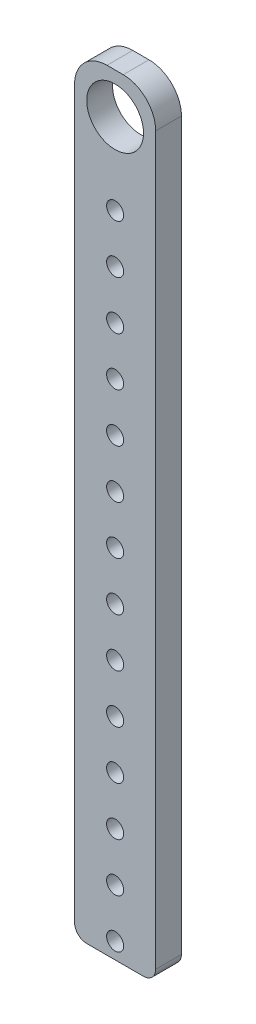
ISO-10303-21;
HEADER;
FILE_DESCRIPTION(('STEP AP214'),'2;1');
FILE_NAME('part.step','',(''),(''),'','','');
FILE_SCHEMA(('AUTOMOTIVE_DESIGN { 1 0 10303 214 1 1 1 1 }'));
ENDSEC;
DATA;
#1=APPLICATION_CONTEXT('core data for automotive mechanical design processes');
#2=APPLICATION_PROTOCOL_DEFINITION('international standard','automotive_design',2000,#1);
#3=PRODUCT_CONTEXT('',#1,'mechanical');
#4=PRODUCT('Part','Part','',(#3));
#5=PRODUCT_RELATED_PRODUCT_CATEGORY('part','',(#4));
#6=PRODUCT_DEFINITION_FORMATION('','',#4);
#7=PRODUCT_DEFINITION_CONTEXT('part definition',#1,'design');
#8=PRODUCT_DEFINITION('design','',#6,#7);
#9=PRODUCT_DEFINITION_SHAPE('','',#8);
#10=(LENGTH_UNIT() NAMED_UNIT(*) SI_UNIT(.MILLI.,.METRE.));
#11=(NAMED_UNIT(*) PLANE_ANGLE_UNIT() SI_UNIT($,.RADIAN.));
#12=(NAMED_UNIT(*) SI_UNIT($,.STERADIAN.) SOLID_ANGLE_UNIT());
#13=UNCERTAINTY_MEASURE_WITH_UNIT(LENGTH_MEASURE(1.E-05),#10,'distance_accuracy_value','');
#14=(GEOMETRIC_REPRESENTATION_CONTEXT(3) GLOBAL_UNCERTAINTY_ASSIGNED_CONTEXT((#13)) GLOBAL_UNIT_ASSIGNED_CONTEXT((#10,
#11,#12)) REPRESENTATION_CONTEXT('',''));
#15=CARTESIAN_POINT('',(0.,0.,0.));
#16=DIRECTION('',(0.,0.,1.));
#17=DIRECTION('',(1.,0.,0.));
#18=AXIS2_PLACEMENT_3D('',#15,#16,#17);
#19=CARTESIAN_POINT('',(0.,0.,6.35));
#20=DIRECTION('',(0.,0.,-1.));
#21=DIRECTION('',(-1.,0.,0.));
#22=AXIS2_PLACEMENT_3D('',#19,#20,#21);
#23=PLANE('',#22);
#24=DIRECTION('',(0.,1.,0.));
#25=VECTOR('',#24,1.);
#26=CARTESIAN_POINT('',(9.99999999999996,-95.0000000000001,6.35));
#27=LINE('',#26,#25);
#28=CARTESIAN_POINT('',(9.99999999999996,-92.0000000000001,6.35));
#29=VERTEX_POINT('',#28);
#30=CARTESIAN_POINT('',(10.,86.9999999999999,6.35));
#31=VERTEX_POINT('',#30);
#32=EDGE_CURVE('E130',#29,#31,#27,.T.);
#33=ORIENTED_EDGE('',*,*,#32,.T.);
#34=CARTESIAN_POINT('',(2.00000000000002,86.9999999999999,6.35));
#35=DIRECTION('',(0.,0.,-1.));
#36=DIRECTION('',(-1.,0.,0.));
#37=AXIS2_PLACEMENT_3D('',#34,#35,#36);
#38=CIRCLE('',#37,8.);
#39=CARTESIAN_POINT('',(2.00000000000001,94.9999999999999,6.35));
#40=VERTEX_POINT('',#39);
#41=EDGE_CURVE('E54',#31,#40,#38,.F.);
#42=ORIENTED_EDGE('',*,*,#41,.T.);
#43=DIRECTION('',(-1.,0.,0.));
#44=VECTOR('',#43,1.);
#45=CARTESIAN_POINT('',(-10.,94.9999999999999,6.35));
#46=LINE('',#45,#44);
#47=CARTESIAN_POINT('',(-2.00000000000002,94.9999999999999,6.35));
#48=VERTEX_POINT('',#47);
#49=EDGE_CURVE('E195',#40,#48,#46,.T.);
#50=ORIENTED_EDGE('',*,*,#49,.T.);
#51=CARTESIAN_POINT('',(-2.00000000000002,86.9999999999999,6.35));
#52=DIRECTION('',(0.,0.,-1.));
#53=DIRECTION('',(-1.,0.,0.));
#54=AXIS2_PLACEMENT_3D('',#51,#52,#53);
#55=CIRCLE('',#54,8.);
#56=CARTESIAN_POINT('',(-10.,86.9999999999999,6.35));
#57=VERTEX_POINT('',#56);
#58=EDGE_CURVE('E61',#48,#57,#55,.F.);
#59=ORIENTED_EDGE('',*,*,#58,.T.);
#60=DIRECTION('',(0.,-1.,0.));
#61=VECTOR('',#60,1.);
#62=CARTESIAN_POINT('',(-10.,-95.0000000000001,6.35));
#63=LINE('',#62,#61);
#64=CARTESIAN_POINT('',(-10.,-92.0000000000001,6.35));
#65=VERTEX_POINT('',#64);
#66=EDGE_CURVE('E202',#57,#65,#63,.T.);
#67=ORIENTED_EDGE('',*,*,#66,.T.);
#68=CARTESIAN_POINT('',(-7.00000000000004,-92.0000000000001,6.35));
#69=DIRECTION('',(0.,0.,-1.));
#70=DIRECTION('',(-1.,0.,0.));
#71=AXIS2_PLACEMENT_3D('',#68,#69,#70);
#72=CIRCLE('',#71,3.);
#73=CARTESIAN_POINT('',(-7.00000000000004,-95.0000000000001,6.35));
#74=VERTEX_POINT('',#73);
#75=EDGE_CURVE('E166',#65,#74,#72,.F.);
#76=ORIENTED_EDGE('',*,*,#75,.T.);
#77=DIRECTION('',(1.,0.,0.));
#78=VECTOR('',#77,1.);
#79=CARTESIAN_POINT('',(-10.,-95.0000000000001,6.35));
#80=LINE('',#79,#78);
#81=CARTESIAN_POINT('',(6.99999999999996,-95.0000000000001,6.35));
#82=VERTEX_POINT('',#81);
#83=EDGE_CURVE('E132',#74,#82,#80,.T.);
#84=ORIENTED_EDGE('',*,*,#83,.T.);
#85=CARTESIAN_POINT('',(6.99999999999996,-92.0000000000001,6.35));
#86=DIRECTION('',(0.,0.,-1.));
#87=DIRECTION('',(-1.,0.,0.));
#88=AXIS2_PLACEMENT_3D('',#85,#86,#87);
#89=CIRCLE('',#88,3.);
#90=EDGE_CURVE('E169',#82,#29,#89,.F.);
#91=ORIENTED_EDGE('',*,*,#90,.T.);
#92=EDGE_LOOP('',(#33,#42,#50,#59,#67,#76,#84,#91));
#93=FACE_BOUND('',#92,.T.);
#94=CARTESIAN_POINT('',(0.,84.9999999999999,6.35));
#95=DIRECTION('',(0.,0.,1.));
#96=DIRECTION('',(1.,0.,0.));
#97=AXIS2_PLACEMENT_3D('',#94,#95,#96);
#98=CIRCLE('',#97,7.);
#99=CARTESIAN_POINT('',(7.,84.9999999999999,6.35));
#100=VERTEX_POINT('',#99);
#101=EDGE_CURVE('E140',#100,#100,#98,.T.);
#102=ORIENTED_EDGE('',*,*,#101,.F.);
#103=EDGE_LOOP('',(#102));
#104=FACE_BOUND('',#103,.T.);
#105=CARTESIAN_POINT('',(-2.65589510718706E-13,-7.0000000000001,6.35));
#106=DIRECTION('',(0.,0.,1.));
#107=DIRECTION('',(1.,0.,0.));
#108=AXIS2_PLACEMENT_3D('',#105,#106,#107);
#109=CIRCLE('',#108,2.1);
#110=CARTESIAN_POINT('',(2.09999999999973,-7.0000000000001,6.35));
#111=VERTEX_POINT('',#110);
#112=EDGE_CURVE('E306',#111,#111,#109,.T.);
#113=ORIENTED_EDGE('',*,*,#112,.F.);
#114=EDGE_LOOP('',(#113));
#115=FACE_BOUND('',#114,.T.);
#116=CARTESIAN_POINT('',(-2.24426522732077E-13,-19.0000000000001,6.35));
#117=DIRECTION('',(0.,0.,1.));
#118=DIRECTION('',(1.,0.,0.));
#119=AXIS2_PLACEMENT_3D('',#116,#117,#118);
#120=CIRCLE('',#119,2.1);
#121=CARTESIAN_POINT('',(2.09999999999978,-19.0000000000001,6.35));
#122=VERTEX_POINT('',#121);
#123=EDGE_CURVE('E312',#122,#122,#120,.T.);
#124=ORIENTED_EDGE('',*,*,#123,.F.);
#125=EDGE_LOOP('',(#124));
#126=FACE_BOUND('',#125,.T.);
#127=CARTESIAN_POINT('',(-3.06752498705335E-13,4.99999999999989,6.35));
#128=DIRECTION('',(0.,0.,1.));
#129=DIRECTION('',(1.,0.,0.));
#130=AXIS2_PLACEMENT_3D('',#127,#128,#129);
#131=CIRCLE('',#130,2.1);
#132=CARTESIAN_POINT('',(2.09999999999969,4.99999999999989,6.35));
#133=VERTEX_POINT('',#132);
#134=EDGE_CURVE('E441',#133,#133,#131,.T.);
#135=ORIENTED_EDGE('',*,*,#134,.F.);
#136=EDGE_LOOP('',(#135));
#137=FACE_BOUND('',#136,.T.);
#138=CARTESIAN_POINT('',(-3.47915486691964E-13,16.9999999999999,6.35));
#139=DIRECTION('',(0.,0.,1.));
#140=DIRECTION('',(1.,0.,0.));
#141=AXIS2_PLACEMENT_3D('',#138,#139,#140);
#142=CIRCLE('',#141,2.1);
#143=CARTESIAN_POINT('',(2.09999999999965,16.9999999999999,6.35));
#144=VERTEX_POINT('',#143);
#145=EDGE_CURVE('E434',#144,#144,#142,.T.);
#146=ORIENTED_EDGE('',*,*,#145,.F.);
#147=EDGE_LOOP('',(#146));
#148=FACE_BOUND('',#147,.T.);
#149=CARTESIAN_POINT('',(-3.89078474678593E-13,28.9999999999999,6.35));
#150=DIRECTION('',(0.,0.,1.));
#151=DIRECTION('',(1.,0.,0.));
#152=AXIS2_PLACEMENT_3D('',#149,#150,#151);
#153=CIRCLE('',#152,2.1);
#154=CARTESIAN_POINT('',(2.09999999999961,28.9999999999999,6.35));
#155=VERTEX_POINT('',#154);
#156=EDGE_CURVE('E427',#155,#155,#153,.T.);
#157=ORIENTED_EDGE('',*,*,#156,.F.);
#158=EDGE_LOOP('',(#157));
#159=FACE_BOUND('',#158,.T.);
#160=CARTESIAN_POINT('',(-4.30241462665223E-13,40.9999999999999,6.35));
#161=DIRECTION('',(0.,0.,1.));
#162=DIRECTION('',(1.,0.,0.));
#163=AXIS2_PLACEMENT_3D('',#160,#161,#162);
#164=CIRCLE('',#163,2.1);
#165=CARTESIAN_POINT('',(2.09999999999957,40.9999999999999,6.35));
#166=VERTEX_POINT('',#165);
#167=EDGE_CURVE('E420',#166,#166,#164,.T.);
#168=ORIENTED_EDGE('',*,*,#167,.F.);
#169=EDGE_LOOP('',(#168));
#170=FACE_BOUND('',#169,.T.);
#171=CARTESIAN_POINT('',(-4.71404450651852E-13,52.9999999999999,6.35));
#172=DIRECTION('',(0.,0.,1.));
#173=DIRECTION('',(1.,0.,0.));
#174=AXIS2_PLACEMENT_3D('',#171,#172,#173);
#175=CIRCLE('',#174,2.1);
#176=CARTESIAN_POINT('',(2.09999999999953,52.9999999999999,6.35));
#177=VERTEX_POINT('',#176);
#178=EDGE_CURVE('E413',#177,#177,#175,.T.);
#179=ORIENTED_EDGE('',*,*,#178,.F.);
#180=EDGE_LOOP('',(#179));
#181=FACE_BOUND('',#180,.T.);
#182=CARTESIAN_POINT('',(-5.12567438638481E-13,64.9999999999999,6.35));
#183=DIRECTION('',(0.,0.,1.));
#184=DIRECTION('',(1.,0.,0.));
#185=AXIS2_PLACEMENT_3D('',#182,#183,#184);
#186=CIRCLE('',#185,2.1);
#187=CARTESIAN_POINT('',(2.09999999999949,64.9999999999999,6.35));
#188=VERTEX_POINT('',#187);
#189=EDGE_CURVE('E406',#188,#188,#186,.T.);
#190=ORIENTED_EDGE('',*,*,#189,.F.);
#191=EDGE_LOOP('',(#190));
#192=FACE_BOUND('',#191,.T.);
#193=CARTESIAN_POINT('',(0.,-91.0000000000001,6.35));
#194=DIRECTION('',(0.,0.,1.));
#195=DIRECTION('',(1.,0.,0.));
#196=AXIS2_PLACEMENT_3D('',#193,#194,#195);
#197=CIRCLE('',#196,2.1);
#198=CARTESIAN_POINT('',(2.10000000000002,-91.0000000000001,6.35));
#199=VERTEX_POINT('',#198);
#200=EDGE_CURVE('E399',#199,#199,#197,.T.);
#201=ORIENTED_EDGE('',*,*,#200,.F.);
#202=EDGE_LOOP('',(#201));
#203=FACE_BOUND('',#202,.T.);
#204=CARTESIAN_POINT('',(0.,-79.0000000000001,6.35));
#205=DIRECTION('',(0.,0.,1.));
#206=DIRECTION('',(1.,0.,0.));
#207=AXIS2_PLACEMENT_3D('',#204,#205,#206);
#208=CIRCLE('',#207,2.1);
#209=CARTESIAN_POINT('',(2.09999999999998,-79.0000000000001,6.35));
#210=VERTEX_POINT('',#209);
#211=EDGE_CURVE('E392',#210,#210,#208,.T.);
#212=ORIENTED_EDGE('',*,*,#211,.F.);
#213=EDGE_LOOP('',(#212));
#214=FACE_BOUND('',#213,.T.);
#215=CARTESIAN_POINT('',(0.,-67.0000000000001,6.35));
#216=DIRECTION('',(0.,0.,1.));
#217=DIRECTION('',(1.,0.,0.));
#218=AXIS2_PLACEMENT_3D('',#215,#216,#217);
#219=CIRCLE('',#218,2.1);
#220=CARTESIAN_POINT('',(2.09999999999994,-67.0000000000001,6.35));
#221=VERTEX_POINT('',#220);
#222=EDGE_CURVE('E385',#221,#221,#219,.T.);
#223=ORIENTED_EDGE('',*,*,#222,.F.);
#224=EDGE_LOOP('',(#223));
#225=FACE_BOUND('',#224,.T.);
#226=CARTESIAN_POINT('',(-1.00937558772189E-13,-55.0000000000001,6.35));
#227=DIRECTION('',(0.,0.,1.));
#228=DIRECTION('',(1.,0.,0.));
#229=AXIS2_PLACEMENT_3D('',#226,#227,#228);
#230=CIRCLE('',#229,2.1);
#231=CARTESIAN_POINT('',(2.0999999999999,-55.0000000000001,6.35));
#232=VERTEX_POINT('',#231);
#233=EDGE_CURVE('E378',#232,#232,#230,.T.);
#234=ORIENTED_EDGE('',*,*,#233,.F.);
#235=EDGE_LOOP('',(#234));
#236=FACE_BOUND('',#235,.T.);
#237=CARTESIAN_POINT('',(-1.42100546758818E-13,-43.0000000000001,6.35));
#238=DIRECTION('',(0.,0.,1.));
#239=DIRECTION('',(1.,0.,0.));
#240=AXIS2_PLACEMENT_3D('',#237,#238,#239);
#241=CIRCLE('',#240,2.1);
#242=CARTESIAN_POINT('',(2.09999999999986,-43.0000000000001,6.35));
#243=VERTEX_POINT('',#242);
#244=EDGE_CURVE('E371',#243,#243,#241,.T.);
#245=ORIENTED_EDGE('',*,*,#244,.F.);
#246=EDGE_LOOP('',(#245));
#247=FACE_BOUND('',#246,.T.);
#248=CARTESIAN_POINT('',(-1.83263534745447E-13,-31.0000000000001,6.35));
#249=DIRECTION('',(0.,0.,1.));
#250=DIRECTION('',(1.,0.,0.));
#251=AXIS2_PLACEMENT_3D('',#248,#249,#250);
#252=CIRCLE('',#251,2.1);
#253=CARTESIAN_POINT('',(2.09999999999982,-31.0000000000001,6.35));
#254=VERTEX_POINT('',#253);
#255=EDGE_CURVE('E365',#254,#254,#252,.T.);
#256=ORIENTED_EDGE('',*,*,#255,.F.);
#257=EDGE_LOOP('',(#256));
#258=FACE_BOUND('',#257,.T.);
#259=ADVANCED_FACE('F45',(#93,#104,#115,#126,#137,#148,#159,#170,#181,#192,#203,#214,#225,#236,
#247,#258),#23,.F.);
#260=CARTESIAN_POINT('',(0.,0.,0.));
#261=DIRECTION('',(0.,0.,-1.));
#262=DIRECTION('',(-1.,0.,0.));
#263=AXIS2_PLACEMENT_3D('',#260,#261,#262);
#264=PLANE('',#263);
#265=CARTESIAN_POINT('',(-1.42100546758818E-13,-43.0000000000001,0.));
#266=DIRECTION('',(0.,0.,1.));
#267=DIRECTION('',(1.,0.,0.));
#268=AXIS2_PLACEMENT_3D('',#265,#266,#267);
#269=CIRCLE('',#268,2.1);
#270=CARTESIAN_POINT('',(2.09999999999986,-43.0000000000001,0.));
#271=VERTEX_POINT('',#270);
#272=EDGE_CURVE('E368',#271,#271,#269,.T.);
#273=ORIENTED_EDGE('',*,*,#272,.T.);
#274=EDGE_LOOP('',(#273));
#275=FACE_BOUND('',#274,.T.);
#276=CARTESIAN_POINT('',(0.,-67.0000000000001,0.));
#277=DIRECTION('',(0.,0.,1.));
#278=DIRECTION('',(1.,0.,0.));
#279=AXIS2_PLACEMENT_3D('',#276,#277,#278);
#280=CIRCLE('',#279,2.1);
#281=CARTESIAN_POINT('',(2.09999999999994,-67.0000000000001,0.));
#282=VERTEX_POINT('',#281);
#283=EDGE_CURVE('E382',#282,#282,#280,.T.);
#284=ORIENTED_EDGE('',*,*,#283,.T.);
#285=EDGE_LOOP('',(#284));
#286=FACE_BOUND('',#285,.T.);
#287=CARTESIAN_POINT('',(0.,-91.0000000000001,0.));
#288=DIRECTION('',(0.,0.,1.));
#289=DIRECTION('',(1.,0.,0.));
#290=AXIS2_PLACEMENT_3D('',#287,#288,#289);
#291=CIRCLE('',#290,2.1);
#292=CARTESIAN_POINT('',(2.10000000000002,-91.0000000000001,0.));
#293=VERTEX_POINT('',#292);
#294=EDGE_CURVE('E396',#293,#293,#291,.T.);
#295=ORIENTED_EDGE('',*,*,#294,.T.);
#296=EDGE_LOOP('',(#295));
#297=FACE_BOUND('',#296,.T.);
#298=CARTESIAN_POINT('',(-4.71404450651852E-13,52.9999999999999,0.));
#299=DIRECTION('',(0.,0.,1.));
#300=DIRECTION('',(1.,0.,0.));
#301=AXIS2_PLACEMENT_3D('',#298,#299,#300);
#302=CIRCLE('',#301,2.1);
#303=CARTESIAN_POINT('',(2.09999999999953,52.9999999999999,0.));
#304=VERTEX_POINT('',#303);
#305=EDGE_CURVE('E410',#304,#304,#302,.T.);
#306=ORIENTED_EDGE('',*,*,#305,.T.);
#307=EDGE_LOOP('',(#306));
#308=FACE_BOUND('',#307,.T.);
#309=CARTESIAN_POINT('',(-3.89078474678593E-13,28.9999999999999,0.));
#310=DIRECTION('',(0.,0.,1.));
#311=DIRECTION('',(1.,0.,0.));
#312=AXIS2_PLACEMENT_3D('',#309,#310,#311);
#313=CIRCLE('',#312,2.1);
#314=CARTESIAN_POINT('',(2.09999999999961,28.9999999999999,0.));
#315=VERTEX_POINT('',#314);
#316=EDGE_CURVE('E424',#315,#315,#313,.T.);
#317=ORIENTED_EDGE('',*,*,#316,.T.);
#318=EDGE_LOOP('',(#317));
#319=FACE_BOUND('',#318,.T.);
#320=CARTESIAN_POINT('',(-3.06752498705335E-13,4.99999999999989,0.));
#321=DIRECTION('',(0.,0.,1.));
#322=DIRECTION('',(1.,0.,0.));
#323=AXIS2_PLACEMENT_3D('',#320,#321,#322);
#324=CIRCLE('',#323,2.1);
#325=CARTESIAN_POINT('',(2.09999999999969,4.99999999999989,0.));
#326=VERTEX_POINT('',#325);
#327=EDGE_CURVE('E438',#326,#326,#324,.T.);
#328=ORIENTED_EDGE('',*,*,#327,.T.);
#329=EDGE_LOOP('',(#328));
#330=FACE_BOUND('',#329,.T.);
#331=CARTESIAN_POINT('',(-2.65589510718706E-13,-7.0000000000001,0.));
#332=DIRECTION('',(0.,0.,1.));
#333=DIRECTION('',(1.,0.,0.));
#334=AXIS2_PLACEMENT_3D('',#331,#332,#333);
#335=CIRCLE('',#334,2.1);
#336=CARTESIAN_POINT('',(2.09999999999973,-7.0000000000001,0.));
#337=VERTEX_POINT('',#336);
#338=EDGE_CURVE('E309',#337,#337,#335,.T.);
#339=ORIENTED_EDGE('',*,*,#338,.T.);
#340=EDGE_LOOP('',(#339));
#341=FACE_BOUND('',#340,.T.);
#342=DIRECTION('',(-1.,0.,0.));
#343=VECTOR('',#342,1.);
#344=CARTESIAN_POINT('',(-10.,94.9999999999999,0.));
#345=LINE('',#344,#343);
#346=CARTESIAN_POINT('',(2.00000000000001,94.9999999999999,0.));
#347=VERTEX_POINT('',#346);
#348=CARTESIAN_POINT('',(-2.00000000000002,94.9999999999999,0.));
#349=VERTEX_POINT('',#348);
#350=EDGE_CURVE('E139',#347,#349,#345,.T.);
#351=ORIENTED_EDGE('',*,*,#350,.F.);
#352=CARTESIAN_POINT('',(2.00000000000002,86.9999999999999,0.));
#353=DIRECTION('',(0.,0.,-1.));
#354=DIRECTION('',(-1.,0.,0.));
#355=AXIS2_PLACEMENT_3D('',#352,#353,#354);
#356=CIRCLE('',#355,8.);
#357=CARTESIAN_POINT('',(10.,86.9999999999999,0.));
#358=VERTEX_POINT('',#357);
#359=EDGE_CURVE('E137',#347,#358,#356,.T.);
#360=ORIENTED_EDGE('',*,*,#359,.T.);
#361=DIRECTION('',(0.,1.,0.));
#362=VECTOR('',#361,1.);
#363=CARTESIAN_POINT('',(9.99999999999996,-95.0000000000001,0.));
#364=LINE('',#363,#362);
#365=CARTESIAN_POINT('',(9.99999999999996,-92.0000000000001,0.));
#366=VERTEX_POINT('',#365);
#367=EDGE_CURVE('E129',#366,#358,#364,.T.);
#368=ORIENTED_EDGE('',*,*,#367,.F.);
#369=CARTESIAN_POINT('',(6.99999999999996,-92.0000000000001,0.));
#370=DIRECTION('',(0.,0.,-1.));
#371=DIRECTION('',(-1.,0.,0.));
#372=AXIS2_PLACEMENT_3D('',#369,#370,#371);
#373=CIRCLE('',#372,3.);
#374=CARTESIAN_POINT('',(6.99999999999996,-95.0000000000001,0.));
#375=VERTEX_POINT('',#374);
#376=EDGE_CURVE('E114',#366,#375,#373,.T.);
#377=ORIENTED_EDGE('',*,*,#376,.T.);
#378=DIRECTION('',(1.,0.,0.));
#379=VECTOR('',#378,1.);
#380=CARTESIAN_POINT('',(-10.,-95.0000000000001,0.));
#381=LINE('',#380,#379);
#382=CARTESIAN_POINT('',(-7.00000000000004,-95.0000000000001,0.));
#383=VERTEX_POINT('',#382);
#384=EDGE_CURVE('E155',#383,#375,#381,.T.);
#385=ORIENTED_EDGE('',*,*,#384,.F.);
#386=CARTESIAN_POINT('',(-7.00000000000004,-92.0000000000001,0.));
#387=DIRECTION('',(0.,0.,-1.));
#388=DIRECTION('',(-1.,0.,0.));
#389=AXIS2_PLACEMENT_3D('',#386,#387,#388);
#390=CIRCLE('',#389,3.);
#391=CARTESIAN_POINT('',(-10.,-92.0000000000001,0.));
#392=VERTEX_POINT('',#391);
#393=EDGE_CURVE('E126',#383,#392,#390,.T.);
#394=ORIENTED_EDGE('',*,*,#393,.T.);
#395=DIRECTION('',(0.,-1.,0.));
#396=VECTOR('',#395,1.);
#397=CARTESIAN_POINT('',(-10.,-95.0000000000001,0.));
#398=LINE('',#397,#396);
#399=CARTESIAN_POINT('',(-10.,86.9999999999999,0.));
#400=VERTEX_POINT('',#399);
#401=EDGE_CURVE('E145',#400,#392,#398,.T.);
#402=ORIENTED_EDGE('',*,*,#401,.F.);
#403=CARTESIAN_POINT('',(-2.00000000000002,86.9999999999999,0.));
#404=DIRECTION('',(0.,0.,-1.));
#405=DIRECTION('',(-1.,0.,0.));
#406=AXIS2_PLACEMENT_3D('',#403,#404,#405);
#407=CIRCLE('',#406,8.);
#408=EDGE_CURVE('E183',#400,#349,#407,.T.);
#409=ORIENTED_EDGE('',*,*,#408,.T.);
#410=EDGE_LOOP('',(#351,#360,#368,#377,#385,#394,#402,#409));
#411=FACE_BOUND('',#410,.T.);
#412=CARTESIAN_POINT('',(0.,84.9999999999999,0.));
#413=DIRECTION('',(0.,0.,1.));
#414=DIRECTION('',(1.,0.,0.));
#415=AXIS2_PLACEMENT_3D('',#412,#413,#414);
#416=CIRCLE('',#415,7.);
#417=CARTESIAN_POINT('',(7.,84.9999999999999,0.));
#418=VERTEX_POINT('',#417);
#419=EDGE_CURVE('E148',#418,#418,#416,.T.);
#420=ORIENTED_EDGE('',*,*,#419,.T.);
#421=EDGE_LOOP('',(#420));
#422=FACE_BOUND('',#421,.T.);
#423=CARTESIAN_POINT('',(-2.24426522732077E-13,-19.0000000000001,0.));
#424=DIRECTION('',(0.,0.,1.));
#425=DIRECTION('',(1.,0.,0.));
#426=AXIS2_PLACEMENT_3D('',#423,#424,#425);
#427=CIRCLE('',#426,2.1);
#428=CARTESIAN_POINT('',(2.09999999999978,-19.0000000000001,0.));
#429=VERTEX_POINT('',#428);
#430=EDGE_CURVE('E318',#429,#429,#427,.T.);
#431=ORIENTED_EDGE('',*,*,#430,.T.);
#432=EDGE_LOOP('',(#431));
#433=FACE_BOUND('',#432,.T.);
#434=CARTESIAN_POINT('',(-3.47915486691964E-13,16.9999999999999,0.));
#435=DIRECTION('',(0.,0.,1.));
#436=DIRECTION('',(1.,0.,0.));
#437=AXIS2_PLACEMENT_3D('',#434,#435,#436);
#438=CIRCLE('',#437,2.1);
#439=CARTESIAN_POINT('',(2.09999999999965,16.9999999999999,0.));
#440=VERTEX_POINT('',#439);
#441=EDGE_CURVE('E344',#440,#440,#438,.T.);
#442=ORIENTED_EDGE('',*,*,#441,.T.);
#443=EDGE_LOOP('',(#442));
#444=FACE_BOUND('',#443,.T.);
#445=CARTESIAN_POINT('',(-4.30241462665223E-13,40.9999999999999,0.));
#446=DIRECTION('',(0.,0.,1.));
#447=DIRECTION('',(1.,0.,0.));
#448=AXIS2_PLACEMENT_3D('',#445,#446,#447);
#449=CIRCLE('',#448,2.1);
#450=CARTESIAN_POINT('',(2.09999999999957,40.9999999999999,0.));
#451=VERTEX_POINT('',#450);
#452=EDGE_CURVE('E348',#451,#451,#449,.T.);
#453=ORIENTED_EDGE('',*,*,#452,.T.);
#454=EDGE_LOOP('',(#453));
#455=FACE_BOUND('',#454,.T.);
#456=CARTESIAN_POINT('',(-5.12567438638481E-13,64.9999999999999,0.));
#457=DIRECTION('',(0.,0.,1.));
#458=DIRECTION('',(1.,0.,0.));
#459=AXIS2_PLACEMENT_3D('',#456,#457,#458);
#460=CIRCLE('',#459,2.1);
#461=CARTESIAN_POINT('',(2.09999999999949,64.9999999999999,0.));
#462=VERTEX_POINT('',#461);
#463=EDGE_CURVE('E352',#462,#462,#460,.T.);
#464=ORIENTED_EDGE('',*,*,#463,.T.);
#465=EDGE_LOOP('',(#464));
#466=FACE_BOUND('',#465,.T.);
#467=CARTESIAN_POINT('',(0.,-79.0000000000001,0.));
#468=DIRECTION('',(0.,0.,1.));
#469=DIRECTION('',(1.,0.,0.));
#470=AXIS2_PLACEMENT_3D('',#467,#468,#469);
#471=CIRCLE('',#470,2.1);
#472=CARTESIAN_POINT('',(2.09999999999998,-79.0000000000001,0.));
#473=VERTEX_POINT('',#472);
#474=EDGE_CURVE('E356',#473,#473,#471,.T.);
#475=ORIENTED_EDGE('',*,*,#474,.T.);
#476=EDGE_LOOP('',(#475));
#477=FACE_BOUND('',#476,.T.);
#478=CARTESIAN_POINT('',(-1.00937558772189E-13,-55.0000000000001,0.));
#479=DIRECTION('',(0.,0.,1.));
#480=DIRECTION('',(1.,0.,0.));
#481=AXIS2_PLACEMENT_3D('',#478,#479,#480);
#482=CIRCLE('',#481,2.1);
#483=CARTESIAN_POINT('',(2.0999999999999,-55.0000000000001,0.));
#484=VERTEX_POINT('',#483);
#485=EDGE_CURVE('E360',#484,#484,#482,.T.);
#486=ORIENTED_EDGE('',*,*,#485,.T.);
#487=EDGE_LOOP('',(#486));
#488=FACE_BOUND('',#487,.T.);
#489=CARTESIAN_POINT('',(-1.83263534745447E-13,-31.0000000000001,0.));
#490=DIRECTION('',(0.,0.,1.));
#491=DIRECTION('',(1.,0.,0.));
#492=AXIS2_PLACEMENT_3D('',#489,#490,#491);
#493=CIRCLE('',#492,2.1);
#494=CARTESIAN_POINT('',(2.09999999999982,-31.0000000000001,0.));
#495=VERTEX_POINT('',#494);
#496=EDGE_CURVE('E363',#495,#495,#493,.T.);
#497=ORIENTED_EDGE('',*,*,#496,.T.);
#498=EDGE_LOOP('',(#497));
#499=FACE_BOUND('',#498,.T.);
#500=ADVANCED_FACE('F135',(#275,#286,#297,#308,#319,#330,#341,#411,#422,#433,#444,#455,#466,
#477,#488,#499),#264,.T.);
#501=CARTESIAN_POINT('',(9.99999999999996,-95.0000000000001,6.35));
#502=DIRECTION('',(-1.,0.,0.));
#503=DIRECTION('',(0.,-1.,0.));
#504=AXIS2_PLACEMENT_3D('',#501,#502,#503);
#505=PLANE('',#504);
#506=ORIENTED_EDGE('',*,*,#367,.T.);
#507=DIRECTION('',(0.,0.,-1.));
#508=VECTOR('',#507,1.);
#509=CARTESIAN_POINT('',(10.,86.9999999999999,6.35));
#510=LINE('',#509,#508);
#511=EDGE_CURVE('E69',#358,#31,#510,.F.);
#512=ORIENTED_EDGE('',*,*,#511,.T.);
#513=ORIENTED_EDGE('',*,*,#32,.F.);
#514=DIRECTION('',(0.,0.,-1.));
#515=VECTOR('',#514,1.);
#516=CARTESIAN_POINT('',(9.99999999999996,-92.0000000000001,6.35));
#517=LINE('',#516,#515);
#518=EDGE_CURVE('E118',#29,#366,#517,.T.);
#519=ORIENTED_EDGE('',*,*,#518,.T.);
#520=EDGE_LOOP('',(#506,#512,#513,#519));
#521=FACE_BOUND('',#520,.T.);
#522=ADVANCED_FACE('F128',(#521),#505,.F.);
#523=CARTESIAN_POINT('',(-10.,94.9999999999999,6.35));
#524=DIRECTION('',(0.,-1.,0.));
#525=DIRECTION('',(0.,0.,-1.));
#526=AXIS2_PLACEMENT_3D('',#523,#524,#525);
#527=PLANE('',#526);
#528=ORIENTED_EDGE('',*,*,#49,.F.);
#529=DIRECTION('',(0.,0.,-1.));
#530=VECTOR('',#529,1.);
#531=CARTESIAN_POINT('',(2.00000000000002,94.9999999999999,6.35));
#532=LINE('',#531,#530);
#533=EDGE_CURVE('E179',#40,#347,#532,.T.);
#534=ORIENTED_EDGE('',*,*,#533,.T.);
#535=ORIENTED_EDGE('',*,*,#350,.T.);
#536=DIRECTION('',(0.,0.,-1.));
#537=VECTOR('',#536,1.);
#538=CARTESIAN_POINT('',(-2.00000000000002,94.9999999999999,6.35));
#539=LINE('',#538,#537);
#540=EDGE_CURVE('E176',#349,#48,#539,.F.);
#541=ORIENTED_EDGE('',*,*,#540,.T.);
#542=EDGE_LOOP('',(#528,#534,#535,#541));
#543=FACE_BOUND('',#542,.T.);
#544=ADVANCED_FACE('F199',(#543),#527,.F.);
#545=CARTESIAN_POINT('',(-10.,-95.0000000000001,6.35));
#546=DIRECTION('',(1.,0.,0.));
#547=DIRECTION('',(0.,1.,0.));
#548=AXIS2_PLACEMENT_3D('',#545,#546,#547);
#549=PLANE('',#548);
#550=ORIENTED_EDGE('',*,*,#66,.F.);
#551=DIRECTION('',(0.,0.,-1.));
#552=VECTOR('',#551,1.);
#553=CARTESIAN_POINT('',(-10.,86.9999999999999,6.35));
#554=LINE('',#553,#552);
#555=EDGE_CURVE('E11',#57,#400,#554,.T.);
#556=ORIENTED_EDGE('',*,*,#555,.T.);
#557=ORIENTED_EDGE('',*,*,#401,.T.);
#558=DIRECTION('',(0.,0.,-1.));
#559=VECTOR('',#558,1.);
#560=CARTESIAN_POINT('',(-10.,-92.0000000000001,6.35));
#561=LINE('',#560,#559);
#562=EDGE_CURVE('E172',#392,#65,#561,.F.);
#563=ORIENTED_EDGE('',*,*,#562,.T.);
#564=EDGE_LOOP('',(#550,#556,#557,#563));
#565=FACE_BOUND('',#564,.T.);
#566=ADVANCED_FACE('F229',(#565),#549,.F.);
#567=CARTESIAN_POINT('',(-10.,-95.0000000000001,6.35));
#568=DIRECTION('',(0.,1.,0.));
#569=DIRECTION('',(0.,0.,1.));
#570=AXIS2_PLACEMENT_3D('',#567,#568,#569);
#571=PLANE('',#570);
#572=ORIENTED_EDGE('',*,*,#384,.T.);
#573=DIRECTION('',(0.,0.,-1.));
#574=VECTOR('',#573,1.);
#575=CARTESIAN_POINT('',(6.99999999999996,-95.0000000000001,6.35));
#576=LINE('',#575,#574);
#577=EDGE_CURVE('E119',#375,#82,#576,.F.);
#578=ORIENTED_EDGE('',*,*,#577,.T.);
#579=ORIENTED_EDGE('',*,*,#83,.F.);
#580=DIRECTION('',(0.,0.,-1.));
#581=VECTOR('',#580,1.);
#582=CARTESIAN_POINT('',(-7.00000000000004,-95.0000000000001,6.35));
#583=LINE('',#582,#581);
#584=EDGE_CURVE('E125',#74,#383,#583,.T.);
#585=ORIENTED_EDGE('',*,*,#584,.T.);
#586=EDGE_LOOP('',(#572,#578,#579,#585));
#587=FACE_BOUND('',#586,.T.);
#588=ADVANCED_FACE('F226',(#587),#571,.F.);
#589=CARTESIAN_POINT('',(0.,84.9999999999999,6.35));
#590=DIRECTION('',(0.,0.,-1.));
#591=DIRECTION('',(-1.,0.,0.));
#592=AXIS2_PLACEMENT_3D('',#589,#590,#591);
#593=CYLINDRICAL_SURFACE('',#592,7.);
#594=ORIENTED_EDGE('',*,*,#101,.T.);
#595=EDGE_LOOP('',(#594));
#596=FACE_BOUND('',#595,.T.);
#597=ORIENTED_EDGE('',*,*,#419,.F.);
#598=EDGE_LOOP('',(#597));
#599=FACE_BOUND('',#598,.T.);
#600=ADVANCED_FACE('F223',(#596,#599),#593,.F.);
#601=CARTESIAN_POINT('',(-2.65589510718706E-13,-7.0000000000001,6.35));
#602=DIRECTION('',(0.,0.,-1.));
#603=DIRECTION('',(-1.,0.,0.));
#604=AXIS2_PLACEMENT_3D('',#601,#602,#603);
#605=CYLINDRICAL_SURFACE('',#604,2.1);
#606=ORIENTED_EDGE('',*,*,#112,.T.);
#607=EDGE_LOOP('',(#606));
#608=FACE_BOUND('',#607,.T.);
#609=ORIENTED_EDGE('',*,*,#338,.F.);
#610=EDGE_LOOP('',(#609));
#611=FACE_BOUND('',#610,.T.);
#612=ADVANCED_FACE('F295',(#608,#611),#605,.F.);
#613=CARTESIAN_POINT('',(-2.24426522732077E-13,-19.0000000000001,6.35));
#614=DIRECTION('',(0.,0.,-1.));
#615=DIRECTION('',(-1.,0.,0.));
#616=AXIS2_PLACEMENT_3D('',#613,#614,#615);
#617=CYLINDRICAL_SURFACE('',#616,2.1);
#618=ORIENTED_EDGE('',*,*,#123,.T.);
#619=EDGE_LOOP('',(#618));
#620=FACE_BOUND('',#619,.T.);
#621=ORIENTED_EDGE('',*,*,#430,.F.);
#622=EDGE_LOOP('',(#621));
#623=FACE_BOUND('',#622,.T.);
#624=ADVANCED_FACE('F292',(#620,#623),#617,.F.);
#625=CARTESIAN_POINT('',(-3.06752498705335E-13,4.99999999999989,6.35));
#626=DIRECTION('',(0.,0.,-1.));
#627=DIRECTION('',(-1.,0.,0.));
#628=AXIS2_PLACEMENT_3D('',#625,#626,#627);
#629=CYLINDRICAL_SURFACE('',#628,2.1);
#630=ORIENTED_EDGE('',*,*,#134,.T.);
#631=EDGE_LOOP('',(#630));
#632=FACE_BOUND('',#631,.T.);
#633=ORIENTED_EDGE('',*,*,#327,.F.);
#634=EDGE_LOOP('',(#633));
#635=FACE_BOUND('',#634,.T.);
#636=ADVANCED_FACE('F288',(#632,#635),#629,.F.);
#637=CARTESIAN_POINT('',(-3.47915486691964E-13,16.9999999999999,6.35));
#638=DIRECTION('',(0.,0.,-1.));
#639=DIRECTION('',(-1.,0.,0.));
#640=AXIS2_PLACEMENT_3D('',#637,#638,#639);
#641=CYLINDRICAL_SURFACE('',#640,2.1);
#642=ORIENTED_EDGE('',*,*,#145,.T.);
#643=EDGE_LOOP('',(#642));
#644=FACE_BOUND('',#643,.T.);
#645=ORIENTED_EDGE('',*,*,#441,.F.);
#646=EDGE_LOOP('',(#645));
#647=FACE_BOUND('',#646,.T.);
#648=ADVANCED_FACE('F284',(#644,#647),#641,.F.);
#649=CARTESIAN_POINT('',(-3.89078474678593E-13,28.9999999999999,6.35));
#650=DIRECTION('',(0.,0.,-1.));
#651=DIRECTION('',(-1.,0.,0.));
#652=AXIS2_PLACEMENT_3D('',#649,#650,#651);
#653=CYLINDRICAL_SURFACE('',#652,2.1);
#654=ORIENTED_EDGE('',*,*,#156,.T.);
#655=EDGE_LOOP('',(#654));
#656=FACE_BOUND('',#655,.T.);
#657=ORIENTED_EDGE('',*,*,#316,.F.);
#658=EDGE_LOOP('',(#657));
#659=FACE_BOUND('',#658,.T.);
#660=ADVANCED_FACE('F280',(#656,#659),#653,.F.);
#661=CARTESIAN_POINT('',(-4.30241462665223E-13,40.9999999999999,6.35));
#662=DIRECTION('',(0.,0.,-1.));
#663=DIRECTION('',(-1.,0.,0.));
#664=AXIS2_PLACEMENT_3D('',#661,#662,#663);
#665=CYLINDRICAL_SURFACE('',#664,2.1);
#666=ORIENTED_EDGE('',*,*,#167,.T.);
#667=EDGE_LOOP('',(#666));
#668=FACE_BOUND('',#667,.T.);
#669=ORIENTED_EDGE('',*,*,#452,.F.);
#670=EDGE_LOOP('',(#669));
#671=FACE_BOUND('',#670,.T.);
#672=ADVANCED_FACE('F276',(#668,#671),#665,.F.);
#673=CARTESIAN_POINT('',(-4.71404450651852E-13,52.9999999999999,6.35));
#674=DIRECTION('',(0.,0.,-1.));
#675=DIRECTION('',(-1.,0.,0.));
#676=AXIS2_PLACEMENT_3D('',#673,#674,#675);
#677=CYLINDRICAL_SURFACE('',#676,2.1);
#678=ORIENTED_EDGE('',*,*,#178,.T.);
#679=EDGE_LOOP('',(#678));
#680=FACE_BOUND('',#679,.T.);
#681=ORIENTED_EDGE('',*,*,#305,.F.);
#682=EDGE_LOOP('',(#681));
#683=FACE_BOUND('',#682,.T.);
#684=ADVANCED_FACE('F272',(#680,#683),#677,.F.);
#685=CARTESIAN_POINT('',(-5.12567438638481E-13,64.9999999999999,6.35));
#686=DIRECTION('',(0.,0.,-1.));
#687=DIRECTION('',(-1.,0.,0.));
#688=AXIS2_PLACEMENT_3D('',#685,#686,#687);
#689=CYLINDRICAL_SURFACE('',#688,2.1);
#690=ORIENTED_EDGE('',*,*,#189,.T.);
#691=EDGE_LOOP('',(#690));
#692=FACE_BOUND('',#691,.T.);
#693=ORIENTED_EDGE('',*,*,#463,.F.);
#694=EDGE_LOOP('',(#693));
#695=FACE_BOUND('',#694,.T.);
#696=ADVANCED_FACE('F268',(#692,#695),#689,.F.);
#697=CARTESIAN_POINT('',(0.,-91.0000000000001,6.35));
#698=DIRECTION('',(0.,0.,-1.));
#699=DIRECTION('',(-1.,0.,0.));
#700=AXIS2_PLACEMENT_3D('',#697,#698,#699);
#701=CYLINDRICAL_SURFACE('',#700,2.1);
#702=ORIENTED_EDGE('',*,*,#200,.T.);
#703=EDGE_LOOP('',(#702));
#704=FACE_BOUND('',#703,.T.);
#705=ORIENTED_EDGE('',*,*,#294,.F.);
#706=EDGE_LOOP('',(#705));
#707=FACE_BOUND('',#706,.T.);
#708=ADVANCED_FACE('F264',(#704,#707),#701,.F.);
#709=CARTESIAN_POINT('',(0.,-79.0000000000001,6.35));
#710=DIRECTION('',(0.,0.,-1.));
#711=DIRECTION('',(-1.,0.,0.));
#712=AXIS2_PLACEMENT_3D('',#709,#710,#711);
#713=CYLINDRICAL_SURFACE('',#712,2.1);
#714=ORIENTED_EDGE('',*,*,#211,.T.);
#715=EDGE_LOOP('',(#714));
#716=FACE_BOUND('',#715,.T.);
#717=ORIENTED_EDGE('',*,*,#474,.F.);
#718=EDGE_LOOP('',(#717));
#719=FACE_BOUND('',#718,.T.);
#720=ADVANCED_FACE('F260',(#716,#719),#713,.F.);
#721=CARTESIAN_POINT('',(0.,-67.0000000000001,6.35));
#722=DIRECTION('',(0.,0.,-1.));
#723=DIRECTION('',(-1.,0.,0.));
#724=AXIS2_PLACEMENT_3D('',#721,#722,#723);
#725=CYLINDRICAL_SURFACE('',#724,2.1);
#726=ORIENTED_EDGE('',*,*,#222,.T.);
#727=EDGE_LOOP('',(#726));
#728=FACE_BOUND('',#727,.T.);
#729=ORIENTED_EDGE('',*,*,#283,.F.);
#730=EDGE_LOOP('',(#729));
#731=FACE_BOUND('',#730,.T.);
#732=ADVANCED_FACE('F256',(#728,#731),#725,.F.);
#733=CARTESIAN_POINT('',(-1.00937558772189E-13,-55.0000000000001,6.35));
#734=DIRECTION('',(0.,0.,-1.));
#735=DIRECTION('',(-1.,0.,0.));
#736=AXIS2_PLACEMENT_3D('',#733,#734,#735);
#737=CYLINDRICAL_SURFACE('',#736,2.1);
#738=ORIENTED_EDGE('',*,*,#233,.T.);
#739=EDGE_LOOP('',(#738));
#740=FACE_BOUND('',#739,.T.);
#741=ORIENTED_EDGE('',*,*,#485,.F.);
#742=EDGE_LOOP('',(#741));
#743=FACE_BOUND('',#742,.T.);
#744=ADVANCED_FACE('F248',(#740,#743),#737,.F.);
#745=CARTESIAN_POINT('',(-1.42100546758818E-13,-43.0000000000001,6.35));
#746=DIRECTION('',(0.,0.,-1.));
#747=DIRECTION('',(-1.,0.,0.));
#748=AXIS2_PLACEMENT_3D('',#745,#746,#747);
#749=CYLINDRICAL_SURFACE('',#748,2.1);
#750=ORIENTED_EDGE('',*,*,#244,.T.);
#751=EDGE_LOOP('',(#750));
#752=FACE_BOUND('',#751,.T.);
#753=ORIENTED_EDGE('',*,*,#272,.F.);
#754=EDGE_LOOP('',(#753));
#755=FACE_BOUND('',#754,.T.);
#756=ADVANCED_FACE('F242',(#752,#755),#749,.F.);
#757=CARTESIAN_POINT('',(-1.83263534745447E-13,-31.0000000000001,6.35));
#758=DIRECTION('',(0.,0.,-1.));
#759=DIRECTION('',(-1.,0.,0.));
#760=AXIS2_PLACEMENT_3D('',#757,#758,#759);
#761=CYLINDRICAL_SURFACE('',#760,2.1);
#762=ORIENTED_EDGE('',*,*,#255,.T.);
#763=EDGE_LOOP('',(#762));
#764=FACE_BOUND('',#763,.T.);
#765=ORIENTED_EDGE('',*,*,#496,.F.);
#766=EDGE_LOOP('',(#765));
#767=FACE_BOUND('',#766,.T.);
#768=ADVANCED_FACE('F238',(#764,#767),#761,.F.);
#769=CARTESIAN_POINT('',(6.99999999999996,-92.0000000000001,6.35));
#770=DIRECTION('',(0.,0.,-1.));
#771=DIRECTION('',(-1.,0.,0.));
#772=AXIS2_PLACEMENT_3D('',#769,#770,#771);
#773=CYLINDRICAL_SURFACE('',#772,3.);
#774=ORIENTED_EDGE('',*,*,#90,.F.);
#775=ORIENTED_EDGE('',*,*,#577,.F.);
#776=ORIENTED_EDGE('',*,*,#376,.F.);
#777=ORIENTED_EDGE('',*,*,#518,.F.);
#778=EDGE_LOOP('',(#774,#775,#776,#777));
#779=FACE_BOUND('',#778,.T.);
#780=ADVANCED_FACE('F117',(#779),#773,.T.);
#781=CARTESIAN_POINT('',(-7.00000000000004,-92.0000000000001,6.35));
#782=DIRECTION('',(0.,0.,-1.));
#783=DIRECTION('',(-1.,0.,0.));
#784=AXIS2_PLACEMENT_3D('',#781,#782,#783);
#785=CYLINDRICAL_SURFACE('',#784,3.);
#786=ORIENTED_EDGE('',*,*,#75,.F.);
#787=ORIENTED_EDGE('',*,*,#562,.F.);
#788=ORIENTED_EDGE('',*,*,#393,.F.);
#789=ORIENTED_EDGE('',*,*,#584,.F.);
#790=EDGE_LOOP('',(#786,#787,#788,#789));
#791=FACE_BOUND('',#790,.T.);
#792=ADVANCED_FACE('F206',(#791),#785,.T.);
#793=CARTESIAN_POINT('',(2.00000000000002,86.9999999999999,6.35));
#794=DIRECTION('',(0.,0.,-1.));
#795=DIRECTION('',(-1.,0.,0.));
#796=AXIS2_PLACEMENT_3D('',#793,#794,#795);
#797=CYLINDRICAL_SURFACE('',#796,8.);
#798=ORIENTED_EDGE('',*,*,#41,.F.);
#799=ORIENTED_EDGE('',*,*,#511,.F.);
#800=ORIENTED_EDGE('',*,*,#359,.F.);
#801=ORIENTED_EDGE('',*,*,#533,.F.);
#802=EDGE_LOOP('',(#798,#799,#800,#801));
#803=FACE_BOUND('',#802,.T.);
#804=ADVANCED_FACE('F204',(#803),#797,.T.);
#805=CARTESIAN_POINT('',(-2.00000000000002,86.9999999999999,6.35));
#806=DIRECTION('',(0.,0.,-1.));
#807=DIRECTION('',(-1.,0.,0.));
#808=AXIS2_PLACEMENT_3D('',#805,#806,#807);
#809=CYLINDRICAL_SURFACE('',#808,8.);
#810=ORIENTED_EDGE('',*,*,#58,.F.);
#811=ORIENTED_EDGE('',*,*,#540,.F.);
#812=ORIENTED_EDGE('',*,*,#408,.F.);
#813=ORIENTED_EDGE('',*,*,#555,.F.);
#814=EDGE_LOOP('',(#810,#811,#812,#813));
#815=FACE_BOUND('',#814,.T.);
#816=ADVANCED_FACE('F47',(#815),#809,.T.);
#817=CLOSED_SHELL('',(#259,#500,#522,#544,#566,#588,#600,#612,#624,#636,#648,#660,#672,#684,
#696,#708,#720,#732,#744,#756,#768,#780,#792,#804,#816));
#818=MANIFOLD_SOLID_BREP('B2',#817);
#819=ADVANCED_BREP_SHAPE_REPRESENTATION('',(#18,#818),#14);
#820=SHAPE_DEFINITION_REPRESENTATION(#9,#819);
ENDSEC;
END-ISO-10303-21;
